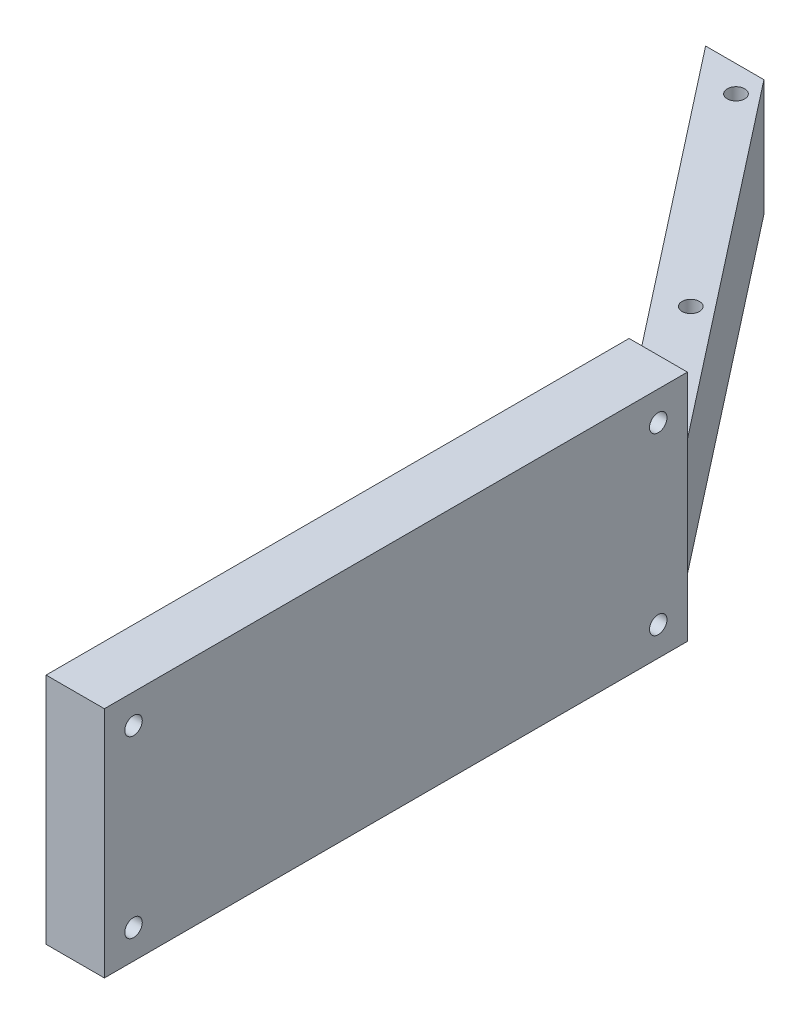
ISO-10303-21;
HEADER;
FILE_DESCRIPTION(('STEP AP214'),'2;1');
FILE_NAME('part.step','',(''),(''),'','','');
FILE_SCHEMA(('AUTOMOTIVE_DESIGN { 1 0 10303 214 1 1 1 1 }'));
ENDSEC;
DATA;
#1=APPLICATION_CONTEXT('core data for automotive mechanical design processes');
#2=APPLICATION_PROTOCOL_DEFINITION('international standard','automotive_design',2000,#1);
#3=PRODUCT_CONTEXT('',#1,'mechanical');
#4=PRODUCT('Part','Part','',(#3));
#5=PRODUCT_RELATED_PRODUCT_CATEGORY('part','',(#4));
#6=PRODUCT_DEFINITION_FORMATION('','',#4);
#7=PRODUCT_DEFINITION_CONTEXT('part definition',#1,'design');
#8=PRODUCT_DEFINITION('design','',#6,#7);
#9=PRODUCT_DEFINITION_SHAPE('','',#8);
#10=(LENGTH_UNIT() NAMED_UNIT(*) SI_UNIT(.MILLI.,.METRE.));
#11=(NAMED_UNIT(*) PLANE_ANGLE_UNIT() SI_UNIT($,.RADIAN.));
#12=(NAMED_UNIT(*) SI_UNIT($,.STERADIAN.) SOLID_ANGLE_UNIT());
#13=UNCERTAINTY_MEASURE_WITH_UNIT(LENGTH_MEASURE(1.E-05),#10,'distance_accuracy_value','');
#14=(GEOMETRIC_REPRESENTATION_CONTEXT(3) GLOBAL_UNCERTAINTY_ASSIGNED_CONTEXT((#13)) GLOBAL_UNIT_ASSIGNED_CONTEXT((#10,
#11,#12)) REPRESENTATION_CONTEXT('',''));
#15=CARTESIAN_POINT('',(0.,0.,0.));
#16=DIRECTION('',(0.,0.,1.));
#17=DIRECTION('',(1.,0.,0.));
#18=AXIS2_PLACEMENT_3D('',#15,#16,#17);
#19=CARTESIAN_POINT('',(10.,20.,50.));
#20=DIRECTION('',(0.,0.,-1.));
#21=DIRECTION('',(0.,1.,0.));
#22=AXIS2_PLACEMENT_3D('',#19,#20,#21);
#23=PLANE('',#22);
#24=DIRECTION('',(0.,-1.,0.));
#25=VECTOR('',#24,1.);
#26=CARTESIAN_POINT('',(0.,20.,50.));
#27=LINE('',#26,#25);
#28=CARTESIAN_POINT('',(0.,20.,50.));
#29=VERTEX_POINT('',#28);
#30=CARTESIAN_POINT('',(0.,-20.,50.));
#31=VERTEX_POINT('',#30);
#32=EDGE_CURVE('E248',#29,#31,#27,.T.);
#33=ORIENTED_EDGE('',*,*,#32,.T.);
#34=DIRECTION('',(-1.,0.,0.));
#35=VECTOR('',#34,1.);
#36=CARTESIAN_POINT('',(10.,-20.,50.));
#37=LINE('',#36,#35);
#38=CARTESIAN_POINT('',(10.,-20.,50.));
#39=VERTEX_POINT('',#38);
#40=EDGE_CURVE('E296',#39,#31,#37,.T.);
#41=ORIENTED_EDGE('',*,*,#40,.F.);
#42=DIRECTION('',(0.,-1.,0.));
#43=VECTOR('',#42,1.);
#44=CARTESIAN_POINT('',(10.,20.,50.));
#45=LINE('',#44,#43);
#46=CARTESIAN_POINT('',(10.,20.,50.));
#47=VERTEX_POINT('',#46);
#48=EDGE_CURVE('E261',#47,#39,#45,.T.);
#49=ORIENTED_EDGE('',*,*,#48,.F.);
#50=DIRECTION('',(-1.,0.,0.));
#51=VECTOR('',#50,1.);
#52=CARTESIAN_POINT('',(10.,20.,50.));
#53=LINE('',#52,#51);
#54=EDGE_CURVE('E276',#47,#29,#53,.T.);
#55=ORIENTED_EDGE('',*,*,#54,.T.);
#56=EDGE_LOOP('',(#33,#41,#49,#55));
#57=FACE_BOUND('',#56,.T.);
#58=ADVANCED_FACE('F47',(#57),#23,.F.);
#59=CARTESIAN_POINT('',(10.,-20.,50.));
#60=DIRECTION('',(0.,1.,0.));
#61=DIRECTION('',(0.,0.,1.));
#62=AXIS2_PLACEMENT_3D('',#59,#60,#61);
#63=PLANE('',#62);
#64=DIRECTION('',(0.,0.,-1.));
#65=VECTOR('',#64,1.);
#66=CARTESIAN_POINT('',(0.,-20.,50.));
#67=LINE('',#66,#65);
#68=CARTESIAN_POINT('',(0.,-20.,-50.));
#69=VERTEX_POINT('',#68);
#70=EDGE_CURVE('E280',#31,#69,#67,.T.);
#71=ORIENTED_EDGE('',*,*,#70,.T.);
#72=DIRECTION('',(-1.,0.,0.));
#73=VECTOR('',#72,1.);
#74=CARTESIAN_POINT('',(10.,-20.,-50.));
#75=LINE('',#74,#73);
#76=CARTESIAN_POINT('',(10.,-20.,-50.));
#77=VERTEX_POINT('',#76);
#78=EDGE_CURVE('E292',#77,#69,#75,.T.);
#79=ORIENTED_EDGE('',*,*,#78,.F.);
#80=DIRECTION('',(0.,0.,-1.));
#81=VECTOR('',#80,1.);
#82=CARTESIAN_POINT('',(10.,-20.,50.));
#83=LINE('',#82,#81);
#84=EDGE_CURVE('E265',#39,#77,#83,.T.);
#85=ORIENTED_EDGE('',*,*,#84,.F.);
#86=ORIENTED_EDGE('',*,*,#40,.T.);
#87=EDGE_LOOP('',(#71,#79,#85,#86));
#88=FACE_BOUND('',#87,.T.);
#89=ADVANCED_FACE('F417',(#88),#63,.F.);
#90=CARTESIAN_POINT('',(10.,20.,-50.));
#91=DIRECTION('',(0.,0.,1.));
#92=DIRECTION('',(0.,-1.,0.));
#93=AXIS2_PLACEMENT_3D('',#90,#91,#92);
#94=PLANE('',#93);
#95=DIRECTION('',(0.,1.,0.));
#96=VECTOR('',#95,1.);
#97=CARTESIAN_POINT('',(0.,20.,-50.));
#98=LINE('',#97,#96);
#99=CARTESIAN_POINT('',(0.,-10.,-50.));
#100=VERTEX_POINT('',#99);
#101=EDGE_CURVE('E283',#69,#100,#98,.T.);
#102=ORIENTED_EDGE('',*,*,#101,.T.);
#103=DIRECTION('',(1.,0.,0.));
#104=VECTOR('',#103,1.);
#105=CARTESIAN_POINT('',(0.,-10.,-50.));
#106=LINE('',#105,#104);
#107=CARTESIAN_POINT('',(10.,-10.,-50.));
#108=VERTEX_POINT('',#107);
#109=EDGE_CURVE('E227',#100,#108,#106,.T.);
#110=ORIENTED_EDGE('',*,*,#109,.T.);
#111=DIRECTION('',(0.,1.,0.));
#112=VECTOR('',#111,1.);
#113=CARTESIAN_POINT('',(10.,20.,-50.));
#114=LINE('',#113,#112);
#115=EDGE_CURVE('E269',#77,#108,#114,.T.);
#116=ORIENTED_EDGE('',*,*,#115,.F.);
#117=ORIENTED_EDGE('',*,*,#78,.T.);
#118=EDGE_LOOP('',(#102,#110,#116,#117));
#119=FACE_BOUND('',#118,.T.);
#120=ADVANCED_FACE('F409',(#119),#94,.F.);
#121=CARTESIAN_POINT('',(10.,20.,50.));
#122=DIRECTION('',(0.,-1.,0.));
#123=DIRECTION('',(0.,0.,-1.));
#124=AXIS2_PLACEMENT_3D('',#121,#122,#123);
#125=PLANE('',#124);
#126=DIRECTION('',(0.,0.,1.));
#127=VECTOR('',#126,1.);
#128=CARTESIAN_POINT('',(10.,20.,50.));
#129=LINE('',#128,#127);
#130=CARTESIAN_POINT('',(10.,20.,-50.));
#131=VERTEX_POINT('',#130);
#132=EDGE_CURVE('E273',#131,#47,#129,.T.);
#133=ORIENTED_EDGE('',*,*,#132,.F.);
#134=DIRECTION('',(1.,0.,0.));
#135=VECTOR('',#134,1.);
#136=CARTESIAN_POINT('',(10.,20.,-50.));
#137=LINE('',#136,#135);
#138=CARTESIAN_POINT('',(0.,20.,-50.));
#139=VERTEX_POINT('',#138);
#140=EDGE_CURVE('E198',#139,#131,#137,.T.);
#141=ORIENTED_EDGE('',*,*,#140,.F.);
#142=DIRECTION('',(0.,0.,1.));
#143=VECTOR('',#142,1.);
#144=CARTESIAN_POINT('',(0.,20.,50.));
#145=LINE('',#144,#143);
#146=EDGE_CURVE('E266',#139,#29,#145,.T.);
#147=ORIENTED_EDGE('',*,*,#146,.T.);
#148=ORIENTED_EDGE('',*,*,#54,.F.);
#149=EDGE_LOOP('',(#133,#141,#147,#148));
#150=FACE_BOUND('',#149,.T.);
#151=ADVANCED_FACE('F397',(#150),#125,.F.);
#152=CARTESIAN_POINT('',(10.,0.,0.));
#153=DIRECTION('',(1.,0.,0.));
#154=DIRECTION('',(0.,0.,-1.));
#155=AXIS2_PLACEMENT_3D('',#152,#153,#154);
#156=PLANE('',#155);
#157=CARTESIAN_POINT('',(10.,15.,-45.));
#158=DIRECTION('',(1.,0.,0.));
#159=DIRECTION('',(0.,0.,-1.));
#160=AXIS2_PLACEMENT_3D('',#157,#158,#159);
#161=CIRCLE('',#160,1.5);
#162=CARTESIAN_POINT('',(10.,15.,-46.5));
#163=VERTEX_POINT('',#162);
#164=EDGE_CURVE('E191',#163,#163,#161,.T.);
#165=ORIENTED_EDGE('',*,*,#164,.F.);
#166=EDGE_LOOP('',(#165));
#167=FACE_BOUND('',#166,.T.);
#168=CARTESIAN_POINT('',(10.,-15.,-45.));
#169=DIRECTION('',(1.,0.,0.));
#170=DIRECTION('',(0.,0.,-1.));
#171=AXIS2_PLACEMENT_3D('',#168,#169,#170);
#172=CIRCLE('',#171,1.5);
#173=CARTESIAN_POINT('',(10.,-15.,-46.5));
#174=VERTEX_POINT('',#173);
#175=EDGE_CURVE('E187',#174,#174,#172,.T.);
#176=ORIENTED_EDGE('',*,*,#175,.F.);
#177=EDGE_LOOP('',(#176));
#178=FACE_BOUND('',#177,.T.);
#179=CARTESIAN_POINT('',(10.,-15.,45.));
#180=DIRECTION('',(1.,0.,0.));
#181=DIRECTION('',(0.,0.,-1.));
#182=AXIS2_PLACEMENT_3D('',#179,#180,#181);
#183=CIRCLE('',#182,1.5);
#184=CARTESIAN_POINT('',(10.,-15.,43.5));
#185=VERTEX_POINT('',#184);
#186=EDGE_CURVE('E182',#185,#185,#183,.T.);
#187=ORIENTED_EDGE('',*,*,#186,.F.);
#188=EDGE_LOOP('',(#187));
#189=FACE_BOUND('',#188,.T.);
#190=CARTESIAN_POINT('',(10.,15.,45.));
#191=DIRECTION('',(1.,0.,0.));
#192=DIRECTION('',(0.,0.,-1.));
#193=AXIS2_PLACEMENT_3D('',#190,#191,#192);
#194=CIRCLE('',#193,1.5);
#195=CARTESIAN_POINT('',(10.,15.,43.5));
#196=VERTEX_POINT('',#195);
#197=EDGE_CURVE('E186',#196,#196,#194,.T.);
#198=ORIENTED_EDGE('',*,*,#197,.F.);
#199=EDGE_LOOP('',(#198));
#200=FACE_BOUND('',#199,.T.);
#201=ORIENTED_EDGE('',*,*,#48,.T.);
#202=ORIENTED_EDGE('',*,*,#84,.T.);
#203=ORIENTED_EDGE('',*,*,#115,.T.);
#204=DIRECTION('',(0.,1.,0.));
#205=VECTOR('',#204,1.);
#206=CARTESIAN_POINT('',(10.,-10.,-50.));
#207=LINE('',#206,#205);
#208=CARTESIAN_POINT('',(10.,10.,-50.));
#209=VERTEX_POINT('',#208);
#210=EDGE_CURVE('E244',#108,#209,#207,.T.);
#211=ORIENTED_EDGE('',*,*,#210,.T.);
#212=DIRECTION('',(0.,1.,0.));
#213=VECTOR('',#212,1.);
#214=CARTESIAN_POINT('',(10.,10.,-50.));
#215=LINE('',#214,#213);
#216=EDGE_CURVE('E215',#209,#131,#215,.T.);
#217=ORIENTED_EDGE('',*,*,#216,.T.);
#218=ORIENTED_EDGE('',*,*,#132,.T.);
#219=EDGE_LOOP('',(#201,#202,#203,#211,#217,#218));
#220=FACE_BOUND('',#219,.T.);
#221=ADVANCED_FACE('F402',(#167,#178,#189,#200,#220),#156,.T.);
#222=CARTESIAN_POINT('',(0.,0.,0.));
#223=DIRECTION('',(1.,0.,0.));
#224=DIRECTION('',(0.,0.,-1.));
#225=AXIS2_PLACEMENT_3D('',#222,#223,#224);
#226=PLANE('',#225);
#227=CARTESIAN_POINT('',(0.,15.,-45.));
#228=DIRECTION('',(1.,0.,0.));
#229=DIRECTION('',(0.,0.,-1.));
#230=AXIS2_PLACEMENT_3D('',#227,#228,#229);
#231=CIRCLE('',#230,2.00000000000002);
#232=CARTESIAN_POINT('',(0.,15.,-47.));
#233=VERTEX_POINT('',#232);
#234=EDGE_CURVE('E321',#233,#233,#231,.T.);
#235=ORIENTED_EDGE('',*,*,#234,.T.);
#236=EDGE_LOOP('',(#235));
#237=FACE_BOUND('',#236,.T.);
#238=CARTESIAN_POINT('',(0.,-15.,-45.));
#239=DIRECTION('',(1.,0.,0.));
#240=DIRECTION('',(0.,0.,-1.));
#241=AXIS2_PLACEMENT_3D('',#238,#239,#240);
#242=CIRCLE('',#241,1.99999999999997);
#243=CARTESIAN_POINT('',(0.,-15.,-47.));
#244=VERTEX_POINT('',#243);
#245=EDGE_CURVE('E317',#244,#244,#242,.T.);
#246=ORIENTED_EDGE('',*,*,#245,.T.);
#247=EDGE_LOOP('',(#246));
#248=FACE_BOUND('',#247,.T.);
#249=CARTESIAN_POINT('',(0.,-15.,45.));
#250=DIRECTION('',(1.,0.,0.));
#251=DIRECTION('',(0.,0.,-1.));
#252=AXIS2_PLACEMENT_3D('',#249,#250,#251);
#253=CIRCLE('',#252,2.00000000000002);
#254=CARTESIAN_POINT('',(0.,-15.,43.));
#255=VERTEX_POINT('',#254);
#256=EDGE_CURVE('E313',#255,#255,#253,.T.);
#257=ORIENTED_EDGE('',*,*,#256,.T.);
#258=EDGE_LOOP('',(#257));
#259=FACE_BOUND('',#258,.T.);
#260=CARTESIAN_POINT('',(0.,15.,45.));
#261=DIRECTION('',(1.,0.,0.));
#262=DIRECTION('',(0.,0.,-1.));
#263=AXIS2_PLACEMENT_3D('',#260,#261,#262);
#264=CIRCLE('',#263,2.00000000000002);
#265=CARTESIAN_POINT('',(0.,15.,43.));
#266=VERTEX_POINT('',#265);
#267=EDGE_CURVE('E300',#266,#266,#264,.T.);
#268=ORIENTED_EDGE('',*,*,#267,.T.);
#269=EDGE_LOOP('',(#268));
#270=FACE_BOUND('',#269,.T.);
#271=DIRECTION('',(0.,1.,0.));
#272=VECTOR('',#271,1.);
#273=CARTESIAN_POINT('',(0.,-6.,-20.));
#274=LINE('',#273,#272);
#275=CARTESIAN_POINT('',(0.,-6.,-20.));
#276=VERTEX_POINT('',#275);
#277=CARTESIAN_POINT('',(0.,6.,-20.));
#278=VERTEX_POINT('',#277);
#279=EDGE_CURVE('E175',#276,#278,#274,.T.);
#280=ORIENTED_EDGE('',*,*,#279,.F.);
#281=DIRECTION('',(0.,0.,-1.));
#282=VECTOR('',#281,1.);
#283=CARTESIAN_POINT('',(0.,-6.,-50.));
#284=LINE('',#283,#282);
#285=CARTESIAN_POINT('',(0.,-6.,-50.));
#286=VERTEX_POINT('',#285);
#287=EDGE_CURVE('E170',#276,#286,#284,.T.);
#288=ORIENTED_EDGE('',*,*,#287,.T.);
#289=DIRECTION('',(0.,1.,0.));
#290=VECTOR('',#289,1.);
#291=CARTESIAN_POINT('',(0.,-10.,-50.));
#292=LINE('',#291,#290);
#293=EDGE_CURVE('E245',#100,#286,#292,.T.);
#294=ORIENTED_EDGE('',*,*,#293,.F.);
#295=ORIENTED_EDGE('',*,*,#101,.F.);
#296=ORIENTED_EDGE('',*,*,#70,.F.);
#297=ORIENTED_EDGE('',*,*,#32,.F.);
#298=ORIENTED_EDGE('',*,*,#146,.F.);
#299=DIRECTION('',(0.,1.,0.));
#300=VECTOR('',#299,1.);
#301=CARTESIAN_POINT('',(0.,10.,-50.));
#302=LINE('',#301,#300);
#303=CARTESIAN_POINT('',(0.,10.,-50.));
#304=VERTEX_POINT('',#303);
#305=EDGE_CURVE('E212',#304,#139,#302,.T.);
#306=ORIENTED_EDGE('',*,*,#305,.F.);
#307=CARTESIAN_POINT('',(0.,6.,-50.));
#308=VERTEX_POINT('',#307);
#309=EDGE_CURVE('E249',#308,#304,#292,.T.);
#310=ORIENTED_EDGE('',*,*,#309,.F.);
#311=DIRECTION('',(0.,0.,-1.));
#312=VECTOR('',#311,1.);
#313=CARTESIAN_POINT('',(0.,6.,-50.));
#314=LINE('',#313,#312);
#315=EDGE_CURVE('E158',#278,#308,#314,.T.);
#316=ORIENTED_EDGE('',*,*,#315,.F.);
#317=EDGE_LOOP('',(#280,#288,#294,#295,#296,#297,#298,#306,#310,#316));
#318=FACE_BOUND('',#317,.T.);
#319=ADVANCED_FACE('F368',(#237,#248,#259,#270,#318),#226,.F.);
#320=CARTESIAN_POINT('',(-46.8771375904028,-10.,-110.));
#321=DIRECTION('',(-0.788010753606723,0.,0.615661475325657));
#322=DIRECTION('',(0.615661475325657,0.,0.788010753606723));
#323=AXIS2_PLACEMENT_3D('',#320,#321,#322);
#324=PLANE('',#323);
#325=DIRECTION('',(-0.615661475325657,0.,-0.788010753606723));
#326=VECTOR('',#325,1.);
#327=CARTESIAN_POINT('',(-9.23492212988485,-6.,-61.8201613041009));
#328=LINE('',#327,#326);
#329=CARTESIAN_POINT('',(-9.23492212988485,-6.,-61.8201613041009));
#330=VERTEX_POINT('',#329);
#331=EDGE_CURVE('E167',#286,#330,#328,.T.);
#332=ORIENTED_EDGE('',*,*,#331,.T.);
#333=DIRECTION('',(0.,1.,0.));
#334=VECTOR('',#333,1.);
#335=CARTESIAN_POINT('',(-9.23492212988485,-6.,-61.8201613041009));
#336=LINE('',#335,#334);
#337=CARTESIAN_POINT('',(-9.23492212988485,6.,-61.8201613041009));
#338=VERTEX_POINT('',#337);
#339=EDGE_CURVE('E148',#330,#338,#336,.T.);
#340=ORIENTED_EDGE('',*,*,#339,.T.);
#341=DIRECTION('',(-0.615661475325657,0.,-0.788010753606723));
#342=VECTOR('',#341,1.);
#343=CARTESIAN_POINT('',(-9.23492212988485,6.,-61.8201613041009));
#344=LINE('',#343,#342);
#345=EDGE_CURVE('E154',#308,#338,#344,.T.);
#346=ORIENTED_EDGE('',*,*,#345,.F.);
#347=ORIENTED_EDGE('',*,*,#309,.T.);
#348=DIRECTION('',(0.615661475325657,0.,0.788010753606723));
#349=VECTOR('',#348,1.);
#350=CARTESIAN_POINT('',(0.,10.,-50.));
#351=LINE('',#350,#349);
#352=CARTESIAN_POINT('',(-46.8771375904028,10.,-110.));
#353=VERTEX_POINT('',#352);
#354=EDGE_CURVE('E205',#353,#304,#351,.T.);
#355=ORIENTED_EDGE('',*,*,#354,.F.);
#356=DIRECTION('',(0.,1.,0.));
#357=VECTOR('',#356,1.);
#358=CARTESIAN_POINT('',(-46.8771375904028,-10.,-110.));
#359=LINE('',#358,#357);
#360=CARTESIAN_POINT('',(-46.8771375904028,-10.,-110.));
#361=VERTEX_POINT('',#360);
#362=EDGE_CURVE('E250',#361,#353,#359,.T.);
#363=ORIENTED_EDGE('',*,*,#362,.F.);
#364=DIRECTION('',(0.615661475325657,0.,0.788010753606723));
#365=VECTOR('',#364,1.);
#366=CARTESIAN_POINT('',(-46.8771375904028,-10.,-110.));
#367=LINE('',#366,#365);
#368=EDGE_CURVE('E240',#361,#100,#367,.T.);
#369=ORIENTED_EDGE('',*,*,#368,.T.);
#370=ORIENTED_EDGE('',*,*,#293,.T.);
#371=EDGE_LOOP('',(#332,#340,#346,#347,#355,#363,#369,#370));
#372=FACE_BOUND('',#371,.T.);
#373=ADVANCED_FACE('F165',(#372),#324,.T.);
#374=CARTESIAN_POINT('',(-46.8771375904028,-10.,-110.));
#375=DIRECTION('',(0.,0.,-1.));
#376=DIRECTION('',(-1.,0.,0.));
#377=AXIS2_PLACEMENT_3D('',#374,#375,#376);
#378=PLANE('',#377);
#379=DIRECTION('',(-1.,0.,0.));
#380=VECTOR('',#379,1.);
#381=CARTESIAN_POINT('',(-46.8771375904028,10.,-110.));
#382=LINE('',#381,#380);
#383=CARTESIAN_POINT('',(-36.8771375904028,10.,-110.));
#384=VERTEX_POINT('',#383);
#385=EDGE_CURVE('E202',#384,#353,#382,.T.);
#386=ORIENTED_EDGE('',*,*,#385,.F.);
#387=DIRECTION('',(0.,1.,0.));
#388=VECTOR('',#387,1.);
#389=CARTESIAN_POINT('',(-36.8771375904028,-10.,-110.));
#390=LINE('',#389,#388);
#391=CARTESIAN_POINT('',(-36.8771375904028,-10.,-110.));
#392=VERTEX_POINT('',#391);
#393=EDGE_CURVE('E254',#392,#384,#390,.T.);
#394=ORIENTED_EDGE('',*,*,#393,.F.);
#395=DIRECTION('',(-1.,0.,0.));
#396=VECTOR('',#395,1.);
#397=CARTESIAN_POINT('',(-46.8771375904028,-10.,-110.));
#398=LINE('',#397,#396);
#399=EDGE_CURVE('E236',#392,#361,#398,.T.);
#400=ORIENTED_EDGE('',*,*,#399,.T.);
#401=ORIENTED_EDGE('',*,*,#362,.T.);
#402=EDGE_LOOP('',(#386,#394,#400,#401));
#403=FACE_BOUND('',#402,.T.);
#404=ADVANCED_FACE('F505',(#403),#378,.T.);
#405=CARTESIAN_POINT('',(10.,-10.,-50.));
#406=DIRECTION('',(0.788010753606723,0.,-0.615661475325657));
#407=DIRECTION('',(-0.615661475325657,0.,-0.788010753606723));
#408=AXIS2_PLACEMENT_3D('',#405,#406,#407);
#409=PLANE('',#408);
#410=DIRECTION('',(-0.615661475325657,0.,-0.788010753606723));
#411=VECTOR('',#410,1.);
#412=CARTESIAN_POINT('',(-36.8771375904028,10.,-110.));
#413=LINE('',#412,#411);
#414=EDGE_CURVE('E199',#209,#384,#413,.T.);
#415=ORIENTED_EDGE('',*,*,#414,.F.);
#416=ORIENTED_EDGE('',*,*,#210,.F.);
#417=DIRECTION('',(-0.615661475325657,0.,-0.788010753606723));
#418=VECTOR('',#417,1.);
#419=CARTESIAN_POINT('',(10.,-10.,-50.));
#420=LINE('',#419,#418);
#421=EDGE_CURVE('E231',#108,#392,#420,.T.);
#422=ORIENTED_EDGE('',*,*,#421,.T.);
#423=ORIENTED_EDGE('',*,*,#393,.T.);
#424=EDGE_LOOP('',(#415,#416,#422,#423));
#425=FACE_BOUND('',#424,.T.);
#426=ADVANCED_FACE('F407',(#425),#409,.T.);
#427=CARTESIAN_POINT('',(0.,-10.,0.));
#428=DIRECTION('',(0.,1.,0.));
#429=DIRECTION('',(0.,0.,1.));
#430=AXIS2_PLACEMENT_3D('',#427,#428,#429);
#431=PLANE('',#430);
#432=CARTESIAN_POINT('',(-37.1684069163404,-10.,-105.5));
#433=DIRECTION('',(0.,1.,0.));
#434=DIRECTION('',(0.,0.,1.));
#435=AXIS2_PLACEMENT_3D('',#432,#433,#434);
#436=CIRCLE('',#435,1.5);
#437=CARTESIAN_POINT('',(-37.1684069163404,-10.,-104.));
#438=VERTEX_POINT('',#437);
#439=EDGE_CURVE('E232',#438,#438,#436,.T.);
#440=ORIENTED_EDGE('',*,*,#439,.T.);
#441=EDGE_LOOP('',(#440));
#442=FACE_BOUND('',#441,.T.);
#443=CARTESIAN_POINT('',(-9.46364052668579,-10.,-70.0395160876975));
#444=DIRECTION('',(0.,1.,0.));
#445=DIRECTION('',(0.,0.,1.));
#446=AXIS2_PLACEMENT_3D('',#443,#444,#445);
#447=CIRCLE('',#446,1.5);
#448=CARTESIAN_POINT('',(-9.46364052668579,-10.,-68.5395160876975));
#449=VERTEX_POINT('',#448);
#450=EDGE_CURVE('E226',#449,#449,#447,.T.);
#451=ORIENTED_EDGE('',*,*,#450,.T.);
#452=EDGE_LOOP('',(#451));
#453=FACE_BOUND('',#452,.T.);
#454=ORIENTED_EDGE('',*,*,#109,.F.);
#455=ORIENTED_EDGE('',*,*,#368,.F.);
#456=ORIENTED_EDGE('',*,*,#399,.F.);
#457=ORIENTED_EDGE('',*,*,#421,.F.);
#458=EDGE_LOOP('',(#454,#455,#456,#457));
#459=FACE_BOUND('',#458,.T.);
#460=ADVANCED_FACE('F413',(#442,#453,#459),#431,.F.);
#461=CARTESIAN_POINT('',(-9.46364052668579,-20.,-70.0395160876975));
#462=DIRECTION('',(0.,1.,0.));
#463=DIRECTION('',(0.,0.,1.));
#464=AXIS2_PLACEMENT_3D('',#461,#462,#463);
#465=CYLINDRICAL_SURFACE('',#464,1.5);
#466=CARTESIAN_POINT('',(-9.46364052668579,10.,-70.0395160876975));
#467=DIRECTION('',(0.,-1.,0.));
#468=DIRECTION('',(0.,0.,-1.));
#469=AXIS2_PLACEMENT_3D('',#466,#467,#468);
#470=CIRCLE('',#469,1.5);
#471=CARTESIAN_POINT('',(-9.46364052668579,10.,-71.5395160876975));
#472=VERTEX_POINT('',#471);
#473=EDGE_CURVE('E222',#472,#472,#470,.F.);
#474=ORIENTED_EDGE('',*,*,#473,.T.);
#475=EDGE_LOOP('',(#474));
#476=FACE_BOUND('',#475,.T.);
#477=ORIENTED_EDGE('',*,*,#450,.F.);
#478=EDGE_LOOP('',(#477));
#479=FACE_BOUND('',#478,.T.);
#480=ADVANCED_FACE('F495',(#476,#479),#465,.F.);
#481=CARTESIAN_POINT('',(-37.1684069163404,-20.,-105.5));
#482=DIRECTION('',(0.,1.,0.));
#483=DIRECTION('',(0.,0.,1.));
#484=AXIS2_PLACEMENT_3D('',#481,#482,#483);
#485=CYLINDRICAL_SURFACE('',#484,1.5);
#486=CARTESIAN_POINT('',(-37.1684069163404,10.,-105.5));
#487=DIRECTION('',(0.,-1.,0.));
#488=DIRECTION('',(0.,0.,-1.));
#489=AXIS2_PLACEMENT_3D('',#486,#487,#488);
#490=CIRCLE('',#489,1.5);
#491=CARTESIAN_POINT('',(-37.1684069163404,10.,-107.));
#492=VERTEX_POINT('',#491);
#493=EDGE_CURVE('E219',#492,#492,#490,.F.);
#494=ORIENTED_EDGE('',*,*,#493,.T.);
#495=EDGE_LOOP('',(#494));
#496=FACE_BOUND('',#495,.T.);
#497=ORIENTED_EDGE('',*,*,#439,.F.);
#498=EDGE_LOOP('',(#497));
#499=FACE_BOUND('',#498,.T.);
#500=ADVANCED_FACE('F489',(#496,#499),#485,.F.);
#501=CARTESIAN_POINT('',(0.,10.,0.));
#502=DIRECTION('',(0.,-1.,0.));
#503=DIRECTION('',(0.,0.,-1.));
#504=AXIS2_PLACEMENT_3D('',#501,#502,#503);
#505=PLANE('',#504);
#506=ORIENTED_EDGE('',*,*,#493,.F.);
#507=EDGE_LOOP('',(#506));
#508=FACE_BOUND('',#507,.T.);
#509=ORIENTED_EDGE('',*,*,#414,.T.);
#510=ORIENTED_EDGE('',*,*,#385,.T.);
#511=ORIENTED_EDGE('',*,*,#354,.T.);
#512=DIRECTION('',(1.,0.,0.));
#513=VECTOR('',#512,1.);
#514=CARTESIAN_POINT('',(10.,10.,-50.));
#515=LINE('',#514,#513);
#516=EDGE_CURVE('E209',#304,#209,#515,.T.);
#517=ORIENTED_EDGE('',*,*,#516,.T.);
#518=EDGE_LOOP('',(#509,#510,#511,#517));
#519=FACE_BOUND('',#518,.T.);
#520=ORIENTED_EDGE('',*,*,#473,.F.);
#521=EDGE_LOOP('',(#520));
#522=FACE_BOUND('',#521,.T.);
#523=ADVANCED_FACE('F384',(#508,#519,#522),#505,.F.);
#524=CARTESIAN_POINT('',(10.,10.,-50.));
#525=DIRECTION('',(0.,0.,1.));
#526=DIRECTION('',(1.,0.,0.));
#527=AXIS2_PLACEMENT_3D('',#524,#525,#526);
#528=PLANE('',#527);
#529=ORIENTED_EDGE('',*,*,#140,.T.);
#530=ORIENTED_EDGE('',*,*,#216,.F.);
#531=ORIENTED_EDGE('',*,*,#516,.F.);
#532=ORIENTED_EDGE('',*,*,#305,.T.);
#533=EDGE_LOOP('',(#529,#530,#531,#532));
#534=FACE_BOUND('',#533,.T.);
#535=ADVANCED_FACE('F389',(#534),#528,.F.);
#536=CARTESIAN_POINT('',(0.,15.,45.));
#537=DIRECTION('',(1.,0.,0.));
#538=DIRECTION('',(0.,0.,-1.));
#539=AXIS2_PLACEMENT_3D('',#536,#537,#538);
#540=CYLINDRICAL_SURFACE('',#539,1.5);
#541=CARTESIAN_POINT('',(0.500000000000003,15.,45.));
#542=DIRECTION('',(1.,0.,0.));
#543=DIRECTION('',(0.,0.,-1.));
#544=AXIS2_PLACEMENT_3D('',#541,#542,#543);
#545=CIRCLE('',#544,1.5);
#546=CARTESIAN_POINT('',(0.500000000000003,15.,43.5));
#547=VERTEX_POINT('',#546);
#548=EDGE_CURVE('E337',#547,#547,#545,.F.);
#549=ORIENTED_EDGE('',*,*,#548,.T.);
#550=EDGE_LOOP('',(#549));
#551=FACE_BOUND('',#550,.T.);
#552=ORIENTED_EDGE('',*,*,#197,.T.);
#553=EDGE_LOOP('',(#552));
#554=FACE_BOUND('',#553,.T.);
#555=ADVANCED_FACE('F476',(#551,#554),#540,.F.);
#556=CARTESIAN_POINT('',(0.,-15.,45.));
#557=DIRECTION('',(1.,0.,0.));
#558=DIRECTION('',(0.,0.,-1.));
#559=AXIS2_PLACEMENT_3D('',#556,#557,#558);
#560=CYLINDRICAL_SURFACE('',#559,1.5);
#561=CARTESIAN_POINT('',(0.500000000000003,-15.,45.));
#562=DIRECTION('',(1.,0.,0.));
#563=DIRECTION('',(0.,0.,-1.));
#564=AXIS2_PLACEMENT_3D('',#561,#562,#563);
#565=CIRCLE('',#564,1.5);
#566=CARTESIAN_POINT('',(0.500000000000003,-15.,43.5));
#567=VERTEX_POINT('',#566);
#568=EDGE_CURVE('E333',#567,#567,#565,.F.);
#569=ORIENTED_EDGE('',*,*,#568,.T.);
#570=EDGE_LOOP('',(#569));
#571=FACE_BOUND('',#570,.T.);
#572=ORIENTED_EDGE('',*,*,#186,.T.);
#573=EDGE_LOOP('',(#572));
#574=FACE_BOUND('',#573,.T.);
#575=ADVANCED_FACE('F472',(#571,#574),#560,.F.);
#576=CARTESIAN_POINT('',(0.,-15.,-45.));
#577=DIRECTION('',(1.,0.,0.));
#578=DIRECTION('',(0.,0.,-1.));
#579=AXIS2_PLACEMENT_3D('',#576,#577,#578);
#580=CYLINDRICAL_SURFACE('',#579,1.5);
#581=CARTESIAN_POINT('',(0.499999999999975,-15.,-45.));
#582=DIRECTION('',(1.,0.,0.));
#583=DIRECTION('',(0.,0.,-1.));
#584=AXIS2_PLACEMENT_3D('',#581,#582,#583);
#585=CIRCLE('',#584,1.5);
#586=CARTESIAN_POINT('',(0.499999999999975,-15.,-46.5));
#587=VERTEX_POINT('',#586);
#588=EDGE_CURVE('E329',#587,#587,#585,.F.);
#589=ORIENTED_EDGE('',*,*,#588,.T.);
#590=EDGE_LOOP('',(#589));
#591=FACE_BOUND('',#590,.T.);
#592=ORIENTED_EDGE('',*,*,#175,.T.);
#593=EDGE_LOOP('',(#592));
#594=FACE_BOUND('',#593,.T.);
#595=ADVANCED_FACE('F475',(#591,#594),#580,.F.);
#596=CARTESIAN_POINT('',(0.,15.,-45.));
#597=DIRECTION('',(1.,0.,0.));
#598=DIRECTION('',(0.,0.,-1.));
#599=AXIS2_PLACEMENT_3D('',#596,#597,#598);
#600=CYLINDRICAL_SURFACE('',#599,1.5);
#601=CARTESIAN_POINT('',(0.500000000000003,15.,-45.));
#602=DIRECTION('',(1.,0.,0.));
#603=DIRECTION('',(0.,0.,-1.));
#604=AXIS2_PLACEMENT_3D('',#601,#602,#603);
#605=CIRCLE('',#604,1.5);
#606=CARTESIAN_POINT('',(0.500000000000003,15.,-46.5));
#607=VERTEX_POINT('',#606);
#608=EDGE_CURVE('E325',#607,#607,#605,.F.);
#609=ORIENTED_EDGE('',*,*,#608,.T.);
#610=EDGE_LOOP('',(#609));
#611=FACE_BOUND('',#610,.T.);
#612=ORIENTED_EDGE('',*,*,#164,.T.);
#613=EDGE_LOOP('',(#612));
#614=FACE_BOUND('',#613,.T.);
#615=ADVANCED_FACE('F436',(#611,#614),#600,.F.);
#616=CARTESIAN_POINT('',(0.,15.,-45.));
#617=DIRECTION('',(-1.,0.,0.));
#618=DIRECTION('',(0.,0.,1.));
#619=AXIS2_PLACEMENT_3D('',#616,#617,#618);
#620=CONICAL_SURFACE('',#619,2.00000000000002,0.785398163397457);
#621=ORIENTED_EDGE('',*,*,#608,.F.);
#622=EDGE_LOOP('',(#621));
#623=FACE_BOUND('',#622,.T.);
#624=ORIENTED_EDGE('',*,*,#234,.F.);
#625=EDGE_LOOP('',(#624));
#626=FACE_BOUND('',#625,.T.);
#627=ADVANCED_FACE('F429',(#623,#626),#620,.F.);
#628=CARTESIAN_POINT('',(0.,-15.,-45.));
#629=DIRECTION('',(-1.,0.,0.));
#630=DIRECTION('',(0.,0.,1.));
#631=AXIS2_PLACEMENT_3D('',#628,#629,#630);
#632=CONICAL_SURFACE('',#631,1.99999999999997,0.785398163397443);
#633=ORIENTED_EDGE('',*,*,#588,.F.);
#634=EDGE_LOOP('',(#633));
#635=FACE_BOUND('',#634,.T.);
#636=ORIENTED_EDGE('',*,*,#245,.F.);
#637=EDGE_LOOP('',(#636));
#638=FACE_BOUND('',#637,.T.);
#639=ADVANCED_FACE('F435',(#635,#638),#632,.F.);
#640=CARTESIAN_POINT('',(0.,-15.,45.));
#641=DIRECTION('',(-1.,0.,0.));
#642=DIRECTION('',(0.,0.,1.));
#643=AXIS2_PLACEMENT_3D('',#640,#641,#642);
#644=CONICAL_SURFACE('',#643,2.00000000000002,0.785398163397457);
#645=ORIENTED_EDGE('',*,*,#568,.F.);
#646=EDGE_LOOP('',(#645));
#647=FACE_BOUND('',#646,.T.);
#648=ORIENTED_EDGE('',*,*,#256,.F.);
#649=EDGE_LOOP('',(#648));
#650=FACE_BOUND('',#649,.T.);
#651=ADVANCED_FACE('F443',(#647,#650),#644,.F.);
#652=CARTESIAN_POINT('',(0.,15.,45.));
#653=DIRECTION('',(-1.,0.,0.));
#654=DIRECTION('',(0.,0.,1.));
#655=AXIS2_PLACEMENT_3D('',#652,#653,#654);
#656=CONICAL_SURFACE('',#655,2.00000000000002,0.785398163397457);
#657=ORIENTED_EDGE('',*,*,#548,.F.);
#658=EDGE_LOOP('',(#657));
#659=FACE_BOUND('',#658,.T.);
#660=ORIENTED_EDGE('',*,*,#267,.F.);
#661=EDGE_LOOP('',(#660));
#662=FACE_BOUND('',#661,.T.);
#663=ADVANCED_FACE('F450',(#659,#662),#656,.F.);
#664=CARTESIAN_POINT('',(-5.,-6.,-50.));
#665=DIRECTION('',(-1.,0.,0.));
#666=DIRECTION('',(0.,0.,1.));
#667=AXIS2_PLACEMENT_3D('',#664,#665,#666);
#668=PLANE('',#667);
#669=DIRECTION('',(0.,0.,1.));
#670=VECTOR('',#669,1.);
#671=CARTESIAN_POINT('',(-5.,-6.,-50.));
#672=LINE('',#671,#670);
#673=CARTESIAN_POINT('',(-5.,-6.,-50.));
#674=VERTEX_POINT('',#673);
#675=CARTESIAN_POINT('',(-5.,-6.,-25.));
#676=VERTEX_POINT('',#675);
#677=EDGE_CURVE('E178',#674,#676,#672,.T.);
#678=ORIENTED_EDGE('',*,*,#677,.T.);
#679=DIRECTION('',(0.,1.,0.));
#680=VECTOR('',#679,1.);
#681=CARTESIAN_POINT('',(-5.,-6.,-25.));
#682=LINE('',#681,#680);
#683=CARTESIAN_POINT('',(-5.,6.,-25.));
#684=VERTEX_POINT('',#683);
#685=EDGE_CURVE('E151',#676,#684,#682,.T.);
#686=ORIENTED_EDGE('',*,*,#685,.T.);
#687=DIRECTION('',(0.,0.,1.));
#688=VECTOR('',#687,1.);
#689=CARTESIAN_POINT('',(-5.,6.,-50.));
#690=LINE('',#689,#688);
#691=CARTESIAN_POINT('',(-5.,6.,-50.));
#692=VERTEX_POINT('',#691);
#693=EDGE_CURVE('E366',#692,#684,#690,.T.);
#694=ORIENTED_EDGE('',*,*,#693,.F.);
#695=DIRECTION('',(0.,1.,0.));
#696=VECTOR('',#695,1.);
#697=CARTESIAN_POINT('',(-5.,-6.,-50.));
#698=LINE('',#697,#696);
#699=EDGE_CURVE('E169',#674,#692,#698,.T.);
#700=ORIENTED_EDGE('',*,*,#699,.F.);
#701=EDGE_LOOP('',(#678,#686,#694,#700));
#702=FACE_BOUND('',#701,.T.);
#703=ADVANCED_FACE('F360',(#702),#668,.T.);
#704=CARTESIAN_POINT('',(-12.339726868884,-6.,-59.3944219884109));
#705=DIRECTION('',(-0.788010753606723,0.,0.615661475325657));
#706=DIRECTION('',(0.615661475325657,0.,0.788010753606723));
#707=AXIS2_PLACEMENT_3D('',#704,#705,#706);
#708=PLANE('',#707);
#709=DIRECTION('',(0.615661475325657,0.,0.788010753606723));
#710=VECTOR('',#709,1.);
#711=CARTESIAN_POINT('',(-12.339726868884,6.,-59.3944219884109));
#712=LINE('',#711,#710);
#713=CARTESIAN_POINT('',(-9.33138326635999,6.,-55.5439177675986));
#714=VERTEX_POINT('',#713);
#715=EDGE_CURVE('E162',#714,#692,#712,.T.);
#716=ORIENTED_EDGE('',*,*,#715,.F.);
#717=DIRECTION('',(0.,-1.,0.));
#718=VECTOR('',#717,1.);
#719=CARTESIAN_POINT('',(-9.33138326635999,-6.,-55.5439177675986));
#720=LINE('',#719,#718);
#721=CARTESIAN_POINT('',(-9.33138326635999,-6.,-55.5439177675986));
#722=VERTEX_POINT('',#721);
#723=EDGE_CURVE('E11',#714,#722,#720,.T.);
#724=ORIENTED_EDGE('',*,*,#723,.T.);
#725=DIRECTION('',(0.615661475325657,0.,0.788010753606723));
#726=VECTOR('',#725,1.);
#727=CARTESIAN_POINT('',(-12.339726868884,-6.,-59.3944219884109));
#728=LINE('',#727,#726);
#729=EDGE_CURVE('E363',#722,#674,#728,.T.);
#730=ORIENTED_EDGE('',*,*,#729,.T.);
#731=ORIENTED_EDGE('',*,*,#699,.T.);
#732=EDGE_LOOP('',(#716,#724,#730,#731));
#733=FACE_BOUND('',#732,.T.);
#734=ADVANCED_FACE('F465',(#733),#708,.T.);
#735=CARTESIAN_POINT('',(0.,-6.,0.));
#736=DIRECTION('',(0.,-1.,0.));
#737=DIRECTION('',(0.,0.,-1.));
#738=AXIS2_PLACEMENT_3D('',#735,#736,#737);
#739=PLANE('',#738);
#740=ORIENTED_EDGE('',*,*,#287,.F.);
#741=CARTESIAN_POINT('',(0.,-6.,-25.));
#742=DIRECTION('',(0.,-1.,0.));
#743=DIRECTION('',(0.,0.,-1.));
#744=AXIS2_PLACEMENT_3D('',#741,#742,#743);
#745=CIRCLE('',#744,5.);
#746=EDGE_CURVE('E56',#276,#676,#745,.T.);
#747=ORIENTED_EDGE('',*,*,#746,.T.);
#748=ORIENTED_EDGE('',*,*,#677,.F.);
#749=ORIENTED_EDGE('',*,*,#729,.F.);
#750=CARTESIAN_POINT('',(-5.39132949832638,-6.,-58.6222251442269));
#751=DIRECTION('',(0.,-1.,0.));
#752=DIRECTION('',(0.,0.,-1.));
#753=AXIS2_PLACEMENT_3D('',#750,#751,#752);
#754=CIRCLE('',#753,5.);
#755=EDGE_CURVE('E346',#722,#330,#754,.T.);
#756=ORIENTED_EDGE('',*,*,#755,.T.);
#757=ORIENTED_EDGE('',*,*,#331,.F.);
#758=EDGE_LOOP('',(#740,#747,#748,#749,#756,#757));
#759=FACE_BOUND('',#758,.T.);
#760=ADVANCED_FACE('F353',(#759),#739,.T.);
#761=CARTESIAN_POINT('',(0.,6.,0.));
#762=DIRECTION('',(0.,-1.,0.));
#763=DIRECTION('',(0.,0.,-1.));
#764=AXIS2_PLACEMENT_3D('',#761,#762,#763);
#765=PLANE('',#764);
#766=ORIENTED_EDGE('',*,*,#693,.T.);
#767=CARTESIAN_POINT('',(0.,6.,-25.));
#768=DIRECTION('',(0.,-1.,0.));
#769=DIRECTION('',(0.,0.,-1.));
#770=AXIS2_PLACEMENT_3D('',#767,#768,#769);
#771=CIRCLE('',#770,5.);
#772=EDGE_CURVE('E150',#684,#278,#771,.F.);
#773=ORIENTED_EDGE('',*,*,#772,.T.);
#774=ORIENTED_EDGE('',*,*,#315,.T.);
#775=ORIENTED_EDGE('',*,*,#345,.T.);
#776=CARTESIAN_POINT('',(-5.39132949832638,6.,-58.6222251442269));
#777=DIRECTION('',(0.,-1.,0.));
#778=DIRECTION('',(0.,0.,-1.));
#779=AXIS2_PLACEMENT_3D('',#776,#777,#778);
#780=CIRCLE('',#779,5.);
#781=EDGE_CURVE('E69',#338,#714,#780,.F.);
#782=ORIENTED_EDGE('',*,*,#781,.T.);
#783=ORIENTED_EDGE('',*,*,#715,.T.);
#784=EDGE_LOOP('',(#766,#773,#774,#775,#782,#783));
#785=FACE_BOUND('',#784,.T.);
#786=ADVANCED_FACE('F156',(#785),#765,.F.);
#787=CARTESIAN_POINT('',(0.,-6.,-25.));
#788=DIRECTION('',(0.,1.,0.));
#789=DIRECTION('',(0.,0.,1.));
#790=AXIS2_PLACEMENT_3D('',#787,#788,#789);
#791=CYLINDRICAL_SURFACE('',#790,5.);
#792=ORIENTED_EDGE('',*,*,#746,.F.);
#793=ORIENTED_EDGE('',*,*,#279,.T.);
#794=ORIENTED_EDGE('',*,*,#772,.F.);
#795=ORIENTED_EDGE('',*,*,#685,.F.);
#796=EDGE_LOOP('',(#792,#793,#794,#795));
#797=FACE_BOUND('',#796,.T.);
#798=ADVANCED_FACE('F365',(#797),#791,.T.);
#799=CARTESIAN_POINT('',(-5.39132949832638,-6.,-58.6222251442269));
#800=DIRECTION('',(0.,1.,0.));
#801=DIRECTION('',(0.,0.,1.));
#802=AXIS2_PLACEMENT_3D('',#799,#800,#801);
#803=CYLINDRICAL_SURFACE('',#802,5.);
#804=ORIENTED_EDGE('',*,*,#755,.F.);
#805=ORIENTED_EDGE('',*,*,#723,.F.);
#806=ORIENTED_EDGE('',*,*,#781,.F.);
#807=ORIENTED_EDGE('',*,*,#339,.F.);
#808=EDGE_LOOP('',(#804,#805,#806,#807));
#809=FACE_BOUND('',#808,.T.);
#810=ADVANCED_FACE('F49',(#809),#803,.T.);
#811=CLOSED_SHELL('',(#58,#89,#120,#151,#221,#319,#373,#404,#426,#460,#480,#500,#523,#535,#555,
#575,#595,#615,#627,#639,#651,#663,#703,#734,#760,#786,#798,#810));
#812=MANIFOLD_SOLID_BREP('B2',#811);
#813=ADVANCED_BREP_SHAPE_REPRESENTATION('',(#18,#812),#14);
#814=SHAPE_DEFINITION_REPRESENTATION(#9,#813);
ENDSEC;
END-ISO-10303-21;
